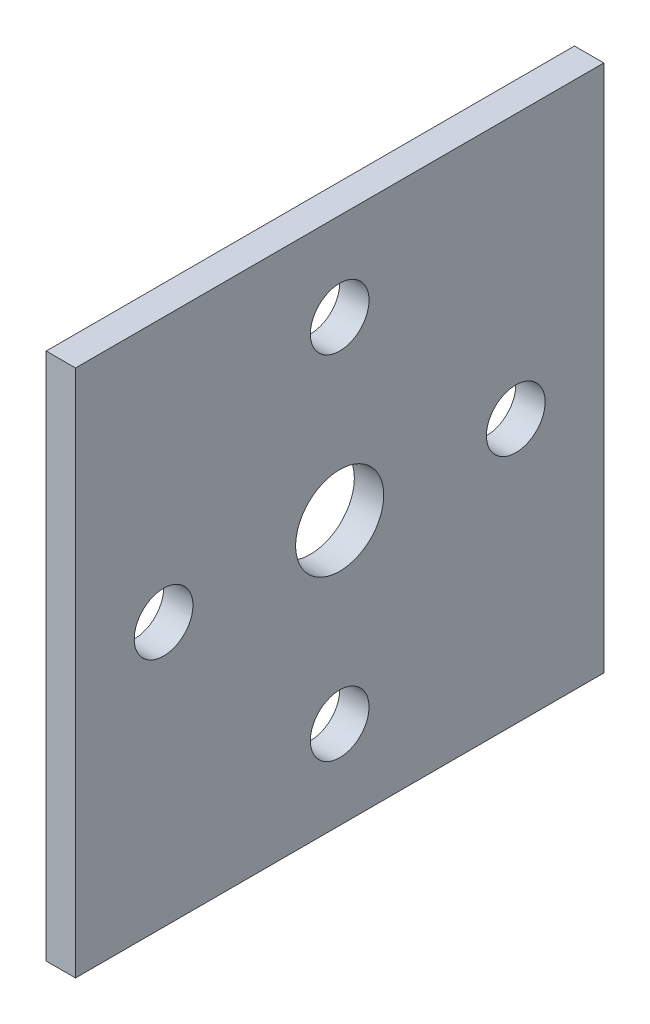
ISO-10303-21;
HEADER;
FILE_DESCRIPTION(('STEP AP214'),'2;1');
FILE_NAME('part.step','',(''),(''),'','','');
FILE_SCHEMA(('AUTOMOTIVE_DESIGN { 1 0 10303 214 1 1 1 1 }'));
ENDSEC;
DATA;
#1=APPLICATION_CONTEXT('core data for automotive mechanical design processes');
#2=APPLICATION_PROTOCOL_DEFINITION('international standard','automotive_design',2000,#1);
#3=PRODUCT_CONTEXT('',#1,'mechanical');
#4=PRODUCT('Part','Part','',(#3));
#5=PRODUCT_RELATED_PRODUCT_CATEGORY('part','',(#4));
#6=PRODUCT_DEFINITION_FORMATION('','',#4);
#7=PRODUCT_DEFINITION_CONTEXT('part definition',#1,'design');
#8=PRODUCT_DEFINITION('design','',#6,#7);
#9=PRODUCT_DEFINITION_SHAPE('','',#8);
#10=(LENGTH_UNIT() NAMED_UNIT(*) SI_UNIT(.MILLI.,.METRE.));
#11=(NAMED_UNIT(*) PLANE_ANGLE_UNIT() SI_UNIT($,.RADIAN.));
#12=(NAMED_UNIT(*) SI_UNIT($,.STERADIAN.) SOLID_ANGLE_UNIT());
#13=UNCERTAINTY_MEASURE_WITH_UNIT(LENGTH_MEASURE(1.E-05),#10,'distance_accuracy_value','');
#14=(GEOMETRIC_REPRESENTATION_CONTEXT(3) GLOBAL_UNCERTAINTY_ASSIGNED_CONTEXT((#13)) GLOBAL_UNIT_ASSIGNED_CONTEXT((#10,
#11,#12)) REPRESENTATION_CONTEXT('',''));
#15=CARTESIAN_POINT('',(0.,0.,0.));
#16=DIRECTION('',(0.,0.,1.));
#17=DIRECTION('',(1.,0.,0.));
#18=AXIS2_PLACEMENT_3D('',#15,#16,#17);
#19=CARTESIAN_POINT('',(3.175,28.575,-28.575));
#20=DIRECTION('',(-1.,0.,0.));
#21=DIRECTION('',(0.,0.,1.));
#22=AXIS2_PLACEMENT_3D('',#19,#20,#21);
#23=PLANE('',#22);
#24=CARTESIAN_POINT('',(3.175,0.,19.05));
#25=DIRECTION('',(1.,0.,0.));
#26=DIRECTION('',(0.,1.,0.));
#27=AXIS2_PLACEMENT_3D('',#24,#25,#26);
#28=CIRCLE('',#27,3.175);
#29=CARTESIAN_POINT('',(3.175,3.17499999999993,19.05));
#30=VERTEX_POINT('',#29);
#31=EDGE_CURVE('E121',#30,#30,#28,.T.);
#32=ORIENTED_EDGE('',*,*,#31,.F.);
#33=EDGE_LOOP('',(#32));
#34=FACE_BOUND('',#33,.T.);
#35=CARTESIAN_POINT('',(3.175,-19.05,0.));
#36=DIRECTION('',(1.,0.,0.));
#37=DIRECTION('',(0.,0.,1.));
#38=AXIS2_PLACEMENT_3D('',#35,#36,#37);
#39=CIRCLE('',#38,3.175);
#40=CARTESIAN_POINT('',(3.175,-19.05,3.175));
#41=VERTEX_POINT('',#40);
#42=EDGE_CURVE('E133',#41,#41,#39,.T.);
#43=ORIENTED_EDGE('',*,*,#42,.F.);
#44=EDGE_LOOP('',(#43));
#45=FACE_BOUND('',#44,.T.);
#46=CARTESIAN_POINT('',(3.175,1.99538158514885E-13,-19.05));
#47=DIRECTION('',(1.,0.,0.));
#48=DIRECTION('',(0.,-1.,0.));
#49=AXIS2_PLACEMENT_3D('',#46,#47,#48);
#50=CIRCLE('',#49,3.175);
#51=CARTESIAN_POINT('',(3.175,-3.1749999999998,-19.05));
#52=VERTEX_POINT('',#51);
#53=EDGE_CURVE('E127',#52,#52,#50,.T.);
#54=ORIENTED_EDGE('',*,*,#53,.F.);
#55=EDGE_LOOP('',(#54));
#56=FACE_BOUND('',#55,.T.);
#57=CARTESIAN_POINT('',(3.175,19.05,0.));
#58=DIRECTION('',(1.,0.,0.));
#59=DIRECTION('',(0.,0.,-1.));
#60=AXIS2_PLACEMENT_3D('',#57,#58,#59);
#61=CIRCLE('',#60,3.175);
#62=CARTESIAN_POINT('',(3.175,19.05,-3.175));
#63=VERTEX_POINT('',#62);
#64=EDGE_CURVE('E115',#63,#63,#61,.T.);
#65=ORIENTED_EDGE('',*,*,#64,.F.);
#66=EDGE_LOOP('',(#65));
#67=FACE_BOUND('',#66,.T.);
#68=DIRECTION('',(0.,1.,0.));
#69=VECTOR('',#68,1.);
#70=CARTESIAN_POINT('',(3.175,-28.575,-28.575));
#71=LINE('',#70,#69);
#72=CARTESIAN_POINT('',(3.175,-28.575,-28.575));
#73=VERTEX_POINT('',#72);
#74=CARTESIAN_POINT('',(3.175,28.575,-28.575));
#75=VERTEX_POINT('',#74);
#76=EDGE_CURVE('E85',#73,#75,#71,.T.);
#77=ORIENTED_EDGE('',*,*,#76,.T.);
#78=DIRECTION('',(0.,0.,1.));
#79=VECTOR('',#78,1.);
#80=CARTESIAN_POINT('',(3.175,28.575,28.575));
#81=LINE('',#80,#79);
#82=CARTESIAN_POINT('',(3.175,28.575,28.575));
#83=VERTEX_POINT('',#82);
#84=EDGE_CURVE('E80',#75,#83,#81,.T.);
#85=ORIENTED_EDGE('',*,*,#84,.T.);
#86=DIRECTION('',(0.,-1.,0.));
#87=VECTOR('',#86,1.);
#88=CARTESIAN_POINT('',(3.175,-28.575,28.575));
#89=LINE('',#88,#87);
#90=CARTESIAN_POINT('',(3.175,-28.575,28.575));
#91=VERTEX_POINT('',#90);
#92=EDGE_CURVE('E83',#83,#91,#89,.T.);
#93=ORIENTED_EDGE('',*,*,#92,.T.);
#94=DIRECTION('',(0.,0.,-1.));
#95=VECTOR('',#94,1.);
#96=CARTESIAN_POINT('',(3.175,-28.575,28.575));
#97=LINE('',#96,#95);
#98=EDGE_CURVE('E50',#91,#73,#97,.T.);
#99=ORIENTED_EDGE('',*,*,#98,.T.);
#100=EDGE_LOOP('',(#77,#85,#93,#99));
#101=FACE_BOUND('',#100,.T.);
#102=CARTESIAN_POINT('',(3.175,0.,0.));
#103=DIRECTION('',(1.,0.,0.));
#104=DIRECTION('',(0.,0.,-1.));
#105=AXIS2_PLACEMENT_3D('',#102,#103,#104);
#106=CIRCLE('',#105,4.7625);
#107=CARTESIAN_POINT('',(3.175,0.,-4.7625));
#108=VERTEX_POINT('',#107);
#109=EDGE_CURVE('E100',#108,#108,#106,.T.);
#110=ORIENTED_EDGE('',*,*,#109,.F.);
#111=EDGE_LOOP('',(#110));
#112=FACE_BOUND('',#111,.T.);
#113=ADVANCED_FACE('F33',(#34,#45,#56,#67,#101,#112),#23,.F.);
#114=CARTESIAN_POINT('',(0.,28.575,-28.575));
#115=DIRECTION('',(-1.,0.,0.));
#116=DIRECTION('',(0.,0.,1.));
#117=AXIS2_PLACEMENT_3D('',#114,#115,#116);
#118=PLANE('',#117);
#119=CARTESIAN_POINT('',(0.,0.,19.05));
#120=DIRECTION('',(1.,0.,0.));
#121=DIRECTION('',(0.,1.,0.));
#122=AXIS2_PLACEMENT_3D('',#119,#120,#121);
#123=CIRCLE('',#122,3.175);
#124=CARTESIAN_POINT('',(0.,3.17499999999993,19.05));
#125=VERTEX_POINT('',#124);
#126=EDGE_CURVE('E136',#125,#125,#123,.T.);
#127=ORIENTED_EDGE('',*,*,#126,.T.);
#128=EDGE_LOOP('',(#127));
#129=FACE_BOUND('',#128,.T.);
#130=CARTESIAN_POINT('',(0.,-19.05,0.));
#131=DIRECTION('',(1.,0.,0.));
#132=DIRECTION('',(0.,0.,1.));
#133=AXIS2_PLACEMENT_3D('',#130,#131,#132);
#134=CIRCLE('',#133,3.175);
#135=CARTESIAN_POINT('',(0.,-19.05,3.175));
#136=VERTEX_POINT('',#135);
#137=EDGE_CURVE('E130',#136,#136,#134,.T.);
#138=ORIENTED_EDGE('',*,*,#137,.T.);
#139=EDGE_LOOP('',(#138));
#140=FACE_BOUND('',#139,.T.);
#141=CARTESIAN_POINT('',(0.,1.99538158514885E-13,-19.05));
#142=DIRECTION('',(1.,0.,0.));
#143=DIRECTION('',(0.,-1.,0.));
#144=AXIS2_PLACEMENT_3D('',#141,#142,#143);
#145=CIRCLE('',#144,3.175);
#146=CARTESIAN_POINT('',(0.,-3.1749999999998,-19.05));
#147=VERTEX_POINT('',#146);
#148=EDGE_CURVE('E124',#147,#147,#145,.T.);
#149=ORIENTED_EDGE('',*,*,#148,.T.);
#150=EDGE_LOOP('',(#149));
#151=FACE_BOUND('',#150,.T.);
#152=CARTESIAN_POINT('',(0.,19.05,0.));
#153=DIRECTION('',(1.,0.,0.));
#154=DIRECTION('',(0.,0.,-1.));
#155=AXIS2_PLACEMENT_3D('',#152,#153,#154);
#156=CIRCLE('',#155,3.175);
#157=CARTESIAN_POINT('',(0.,19.05,-3.175));
#158=VERTEX_POINT('',#157);
#159=EDGE_CURVE('E118',#158,#158,#156,.T.);
#160=ORIENTED_EDGE('',*,*,#159,.T.);
#161=EDGE_LOOP('',(#160));
#162=FACE_BOUND('',#161,.T.);
#163=DIRECTION('',(0.,1.,0.));
#164=VECTOR('',#163,1.);
#165=CARTESIAN_POINT('',(0.,-28.575,-28.575));
#166=LINE('',#165,#164);
#167=CARTESIAN_POINT('',(0.,-28.575,-28.575));
#168=VERTEX_POINT('',#167);
#169=CARTESIAN_POINT('',(0.,28.575,-28.575));
#170=VERTEX_POINT('',#169);
#171=EDGE_CURVE('E97',#168,#170,#166,.T.);
#172=ORIENTED_EDGE('',*,*,#171,.F.);
#173=DIRECTION('',(0.,0.,-1.));
#174=VECTOR('',#173,1.);
#175=CARTESIAN_POINT('',(0.,-28.575,28.575));
#176=LINE('',#175,#174);
#177=CARTESIAN_POINT('',(0.,-28.575,28.575));
#178=VERTEX_POINT('',#177);
#179=EDGE_CURVE('E73',#178,#168,#176,.T.);
#180=ORIENTED_EDGE('',*,*,#179,.F.);
#181=DIRECTION('',(0.,-1.,0.));
#182=VECTOR('',#181,1.);
#183=CARTESIAN_POINT('',(0.,-28.575,28.575));
#184=LINE('',#183,#182);
#185=CARTESIAN_POINT('',(0.,28.575,28.575));
#186=VERTEX_POINT('',#185);
#187=EDGE_CURVE('E67',#186,#178,#184,.T.);
#188=ORIENTED_EDGE('',*,*,#187,.F.);
#189=DIRECTION('',(0.,0.,1.));
#190=VECTOR('',#189,1.);
#191=CARTESIAN_POINT('',(0.,28.575,28.575));
#192=LINE('',#191,#190);
#193=EDGE_CURVE('E89',#170,#186,#192,.T.);
#194=ORIENTED_EDGE('',*,*,#193,.F.);
#195=EDGE_LOOP('',(#172,#180,#188,#194));
#196=FACE_BOUND('',#195,.T.);
#197=CARTESIAN_POINT('',(0.,0.,0.));
#198=DIRECTION('',(1.,0.,0.));
#199=DIRECTION('',(0.,0.,-1.));
#200=AXIS2_PLACEMENT_3D('',#197,#198,#199);
#201=CIRCLE('',#200,4.7625);
#202=CARTESIAN_POINT('',(0.,0.,-4.7625));
#203=VERTEX_POINT('',#202);
#204=EDGE_CURVE('E112',#203,#203,#201,.T.);
#205=ORIENTED_EDGE('',*,*,#204,.T.);
#206=EDGE_LOOP('',(#205));
#207=FACE_BOUND('',#206,.T.);
#208=ADVANCED_FACE('F108',(#129,#140,#151,#162,#196,#207),#118,.T.);
#209=CARTESIAN_POINT('',(3.175,-28.575,-28.575));
#210=DIRECTION('',(0.,0.,1.));
#211=DIRECTION('',(1.,0.,0.));
#212=AXIS2_PLACEMENT_3D('',#209,#210,#211);
#213=PLANE('',#212);
#214=ORIENTED_EDGE('',*,*,#171,.T.);
#215=DIRECTION('',(-1.,0.,0.));
#216=VECTOR('',#215,1.);
#217=CARTESIAN_POINT('',(3.175,28.575,-28.575));
#218=LINE('',#217,#216);
#219=EDGE_CURVE('E11',#75,#170,#218,.T.);
#220=ORIENTED_EDGE('',*,*,#219,.F.);
#221=ORIENTED_EDGE('',*,*,#76,.F.);
#222=DIRECTION('',(-1.,0.,0.));
#223=VECTOR('',#222,1.);
#224=CARTESIAN_POINT('',(3.175,-28.575,-28.575));
#225=LINE('',#224,#223);
#226=EDGE_CURVE('E93',#73,#168,#225,.T.);
#227=ORIENTED_EDGE('',*,*,#226,.T.);
#228=EDGE_LOOP('',(#214,#220,#221,#227));
#229=FACE_BOUND('',#228,.T.);
#230=ADVANCED_FACE('F35',(#229),#213,.F.);
#231=CARTESIAN_POINT('',(3.175,28.575,28.575));
#232=DIRECTION('',(0.,-1.,0.));
#233=DIRECTION('',(0.,0.,-1.));
#234=AXIS2_PLACEMENT_3D('',#231,#232,#233);
#235=PLANE('',#234);
#236=ORIENTED_EDGE('',*,*,#193,.T.);
#237=DIRECTION('',(-1.,0.,0.));
#238=VECTOR('',#237,1.);
#239=CARTESIAN_POINT('',(3.175,28.575,28.575));
#240=LINE('',#239,#238);
#241=EDGE_CURVE('E42',#83,#186,#240,.T.);
#242=ORIENTED_EDGE('',*,*,#241,.F.);
#243=ORIENTED_EDGE('',*,*,#84,.F.);
#244=ORIENTED_EDGE('',*,*,#219,.T.);
#245=EDGE_LOOP('',(#236,#242,#243,#244));
#246=FACE_BOUND('',#245,.T.);
#247=ADVANCED_FACE('F88',(#246),#235,.F.);
#248=CARTESIAN_POINT('',(3.175,-28.575,28.575));
#249=DIRECTION('',(0.,0.,-1.));
#250=DIRECTION('',(-1.,0.,0.));
#251=AXIS2_PLACEMENT_3D('',#248,#249,#250);
#252=PLANE('',#251);
#253=ORIENTED_EDGE('',*,*,#187,.T.);
#254=DIRECTION('',(-1.,0.,0.));
#255=VECTOR('',#254,1.);
#256=CARTESIAN_POINT('',(3.175,-28.575,28.575));
#257=LINE('',#256,#255);
#258=EDGE_CURVE('E90',#91,#178,#257,.T.);
#259=ORIENTED_EDGE('',*,*,#258,.F.);
#260=ORIENTED_EDGE('',*,*,#92,.F.);
#261=ORIENTED_EDGE('',*,*,#241,.T.);
#262=EDGE_LOOP('',(#253,#259,#260,#261));
#263=FACE_BOUND('',#262,.T.);
#264=ADVANCED_FACE('F91',(#263),#252,.F.);
#265=CARTESIAN_POINT('',(3.175,-28.575,28.575));
#266=DIRECTION('',(0.,1.,0.));
#267=DIRECTION('',(0.,0.,1.));
#268=AXIS2_PLACEMENT_3D('',#265,#266,#267);
#269=PLANE('',#268);
#270=ORIENTED_EDGE('',*,*,#179,.T.);
#271=ORIENTED_EDGE('',*,*,#226,.F.);
#272=ORIENTED_EDGE('',*,*,#98,.F.);
#273=ORIENTED_EDGE('',*,*,#258,.T.);
#274=EDGE_LOOP('',(#270,#271,#272,#273));
#275=FACE_BOUND('',#274,.T.);
#276=ADVANCED_FACE('F105',(#275),#269,.F.);
#277=CARTESIAN_POINT('',(3.175,0.,0.));
#278=DIRECTION('',(-1.,0.,0.));
#279=DIRECTION('',(0.,0.,1.));
#280=AXIS2_PLACEMENT_3D('',#277,#278,#279);
#281=CYLINDRICAL_SURFACE('',#280,4.7625);
#282=ORIENTED_EDGE('',*,*,#109,.T.);
#283=EDGE_LOOP('',(#282));
#284=FACE_BOUND('',#283,.T.);
#285=ORIENTED_EDGE('',*,*,#204,.F.);
#286=EDGE_LOOP('',(#285));
#287=FACE_BOUND('',#286,.T.);
#288=ADVANCED_FACE('F158',(#284,#287),#281,.F.);
#289=CARTESIAN_POINT('',(3.175,19.05,0.));
#290=DIRECTION('',(-1.,0.,0.));
#291=DIRECTION('',(0.,0.,1.));
#292=AXIS2_PLACEMENT_3D('',#289,#290,#291);
#293=CYLINDRICAL_SURFACE('',#292,3.175);
#294=ORIENTED_EDGE('',*,*,#64,.T.);
#295=EDGE_LOOP('',(#294));
#296=FACE_BOUND('',#295,.T.);
#297=ORIENTED_EDGE('',*,*,#159,.F.);
#298=EDGE_LOOP('',(#297));
#299=FACE_BOUND('',#298,.T.);
#300=ADVANCED_FACE('F154',(#296,#299),#293,.F.);
#301=CARTESIAN_POINT('',(3.175,1.99538158514885E-13,-19.05));
#302=DIRECTION('',(-1.,0.,0.));
#303=DIRECTION('',(0.,0.,1.));
#304=AXIS2_PLACEMENT_3D('',#301,#302,#303);
#305=CYLINDRICAL_SURFACE('',#304,3.175);
#306=ORIENTED_EDGE('',*,*,#53,.T.);
#307=EDGE_LOOP('',(#306));
#308=FACE_BOUND('',#307,.T.);
#309=ORIENTED_EDGE('',*,*,#148,.F.);
#310=EDGE_LOOP('',(#309));
#311=FACE_BOUND('',#310,.T.);
#312=ADVANCED_FACE('F157',(#308,#311),#305,.F.);
#313=CARTESIAN_POINT('',(3.175,-19.05,0.));
#314=DIRECTION('',(-1.,0.,0.));
#315=DIRECTION('',(0.,0.,1.));
#316=AXIS2_PLACEMENT_3D('',#313,#314,#315);
#317=CYLINDRICAL_SURFACE('',#316,3.175);
#318=ORIENTED_EDGE('',*,*,#42,.T.);
#319=EDGE_LOOP('',(#318));
#320=FACE_BOUND('',#319,.T.);
#321=ORIENTED_EDGE('',*,*,#137,.F.);
#322=EDGE_LOOP('',(#321));
#323=FACE_BOUND('',#322,.T.);
#324=ADVANCED_FACE('F204',(#320,#323),#317,.F.);
#325=CARTESIAN_POINT('',(3.175,0.,19.05));
#326=DIRECTION('',(-1.,0.,0.));
#327=DIRECTION('',(0.,0.,1.));
#328=AXIS2_PLACEMENT_3D('',#325,#326,#327);
#329=CYLINDRICAL_SURFACE('',#328,3.175);
#330=ORIENTED_EDGE('',*,*,#31,.T.);
#331=EDGE_LOOP('',(#330));
#332=FACE_BOUND('',#331,.T.);
#333=ORIENTED_EDGE('',*,*,#126,.F.);
#334=EDGE_LOOP('',(#333));
#335=FACE_BOUND('',#334,.T.);
#336=ADVANCED_FACE('F142',(#332,#335),#329,.F.);
#337=CLOSED_SHELL('',(#113,#208,#230,#247,#264,#276,#288,#300,#312,#324,#336));
#338=MANIFOLD_SOLID_BREP('B2',#337);
#339=ADVANCED_BREP_SHAPE_REPRESENTATION('',(#18,#338),#14);
#340=SHAPE_DEFINITION_REPRESENTATION(#9,#339);
ENDSEC;
END-ISO-10303-21;
